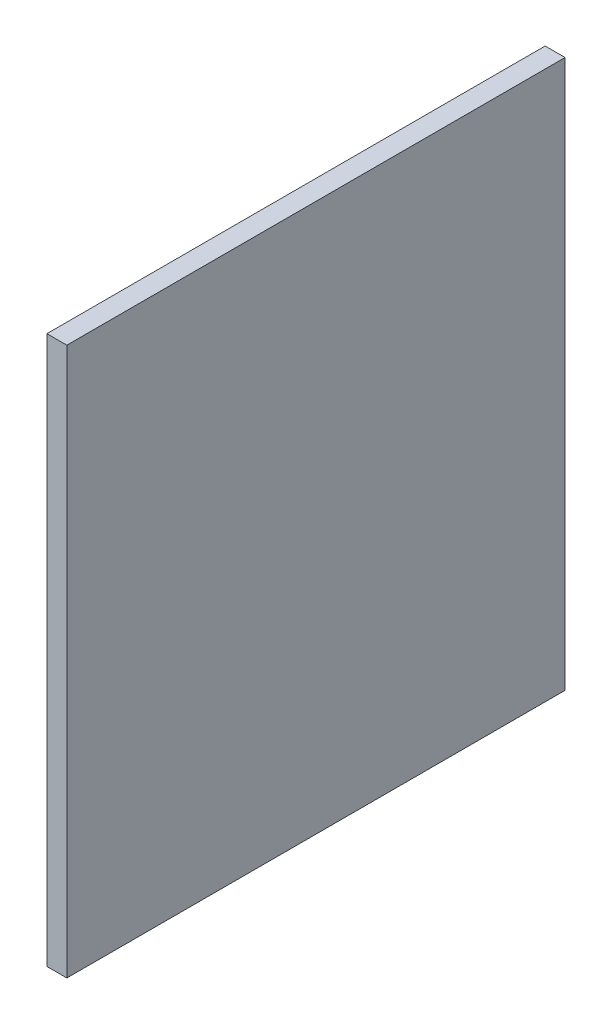
ISO-10303-21;
HEADER;
FILE_DESCRIPTION(('STEP AP214'),'2;1');
FILE_NAME('part.step','',(''),(''),'','','');
FILE_SCHEMA(('AUTOMOTIVE_DESIGN { 1 0 10303 214 1 1 1 1 }'));
ENDSEC;
DATA;
#1=APPLICATION_CONTEXT('core data for automotive mechanical design processes');
#2=APPLICATION_PROTOCOL_DEFINITION('international standard','automotive_design',2000,#1);
#3=PRODUCT_CONTEXT('',#1,'mechanical');
#4=PRODUCT('Part','Part','',(#3));
#5=PRODUCT_RELATED_PRODUCT_CATEGORY('part','',(#4));
#6=PRODUCT_DEFINITION_FORMATION('','',#4);
#7=PRODUCT_DEFINITION_CONTEXT('part definition',#1,'design');
#8=PRODUCT_DEFINITION('design','',#6,#7);
#9=PRODUCT_DEFINITION_SHAPE('','',#8);
#10=(LENGTH_UNIT() NAMED_UNIT(*) SI_UNIT(.MILLI.,.METRE.));
#11=(NAMED_UNIT(*) PLANE_ANGLE_UNIT() SI_UNIT($,.RADIAN.));
#12=(NAMED_UNIT(*) SI_UNIT($,.STERADIAN.) SOLID_ANGLE_UNIT());
#13=UNCERTAINTY_MEASURE_WITH_UNIT(LENGTH_MEASURE(1.E-05),#10,'distance_accuracy_value','');
#14=(GEOMETRIC_REPRESENTATION_CONTEXT(3) GLOBAL_UNCERTAINTY_ASSIGNED_CONTEXT((#13)) GLOBAL_UNIT_ASSIGNED_CONTEXT((#10,
#11,#12)) REPRESENTATION_CONTEXT('',''));
#15=CARTESIAN_POINT('',(0.,0.,0.));
#16=DIRECTION('',(0.,0.,1.));
#17=DIRECTION('',(1.,0.,0.));
#18=AXIS2_PLACEMENT_3D('',#15,#16,#17);
#19=CARTESIAN_POINT('',(2.,-27.5,25.));
#20=DIRECTION('',(0.,0.,-1.));
#21=DIRECTION('',(0.,1.,0.));
#22=AXIS2_PLACEMENT_3D('',#19,#20,#21);
#23=PLANE('',#22);
#24=DIRECTION('',(0.,-1.,0.));
#25=VECTOR('',#24,1.);
#26=CARTESIAN_POINT('',(0.,-27.5,25.));
#27=LINE('',#26,#25);
#28=CARTESIAN_POINT('',(0.,27.5,25.));
#29=VERTEX_POINT('',#28);
#30=CARTESIAN_POINT('',(0.,-27.5,25.));
#31=VERTEX_POINT('',#30);
#32=EDGE_CURVE('E96',#29,#31,#27,.T.);
#33=ORIENTED_EDGE('',*,*,#32,.T.);
#34=DIRECTION('',(-1.,0.,0.));
#35=VECTOR('',#34,1.);
#36=CARTESIAN_POINT('',(2.,-27.5,25.));
#37=LINE('',#36,#35);
#38=CARTESIAN_POINT('',(2.,-27.5,25.));
#39=VERTEX_POINT('',#38);
#40=EDGE_CURVE('E11',#39,#31,#37,.T.);
#41=ORIENTED_EDGE('',*,*,#40,.F.);
#42=DIRECTION('',(0.,-1.,0.));
#43=VECTOR('',#42,1.);
#44=CARTESIAN_POINT('',(2.,-27.5,25.));
#45=LINE('',#44,#43);
#46=CARTESIAN_POINT('',(2.,27.5,25.));
#47=VERTEX_POINT('',#46);
#48=EDGE_CURVE('E84',#47,#39,#45,.T.);
#49=ORIENTED_EDGE('',*,*,#48,.F.);
#50=DIRECTION('',(-1.,0.,0.));
#51=VECTOR('',#50,1.);
#52=CARTESIAN_POINT('',(2.,27.5,25.));
#53=LINE('',#52,#51);
#54=EDGE_CURVE('E92',#47,#29,#53,.T.);
#55=ORIENTED_EDGE('',*,*,#54,.T.);
#56=EDGE_LOOP('',(#33,#41,#49,#55));
#57=FACE_BOUND('',#56,.T.);
#58=ADVANCED_FACE('F33',(#57),#23,.F.);
#59=CARTESIAN_POINT('',(2.,-27.5,-25.));
#60=DIRECTION('',(0.,1.,0.));
#61=DIRECTION('',(0.,0.,1.));
#62=AXIS2_PLACEMENT_3D('',#59,#60,#61);
#63=PLANE('',#62);
#64=DIRECTION('',(0.,0.,-1.));
#65=VECTOR('',#64,1.);
#66=CARTESIAN_POINT('',(0.,-27.5,-25.));
#67=LINE('',#66,#65);
#68=CARTESIAN_POINT('',(0.,-27.5,-25.));
#69=VERTEX_POINT('',#68);
#70=EDGE_CURVE('E88',#31,#69,#67,.T.);
#71=ORIENTED_EDGE('',*,*,#70,.T.);
#72=DIRECTION('',(-1.,0.,0.));
#73=VECTOR('',#72,1.);
#74=CARTESIAN_POINT('',(2.,-27.5,-25.));
#75=LINE('',#74,#73);
#76=CARTESIAN_POINT('',(2.,-27.5,-25.));
#77=VERTEX_POINT('',#76);
#78=EDGE_CURVE('E41',#77,#69,#75,.T.);
#79=ORIENTED_EDGE('',*,*,#78,.F.);
#80=DIRECTION('',(0.,0.,-1.));
#81=VECTOR('',#80,1.);
#82=CARTESIAN_POINT('',(2.,-27.5,-25.));
#83=LINE('',#82,#81);
#84=EDGE_CURVE('E79',#39,#77,#83,.T.);
#85=ORIENTED_EDGE('',*,*,#84,.F.);
#86=ORIENTED_EDGE('',*,*,#40,.T.);
#87=EDGE_LOOP('',(#71,#79,#85,#86));
#88=FACE_BOUND('',#87,.T.);
#89=ADVANCED_FACE('F87',(#88),#63,.F.);
#90=CARTESIAN_POINT('',(2.,-27.5,-25.));
#91=DIRECTION('',(0.,0.,1.));
#92=DIRECTION('',(1.,0.,0.));
#93=AXIS2_PLACEMENT_3D('',#90,#91,#92);
#94=PLANE('',#93);
#95=DIRECTION('',(0.,1.,0.));
#96=VECTOR('',#95,1.);
#97=CARTESIAN_POINT('',(0.,-27.5,-25.));
#98=LINE('',#97,#96);
#99=CARTESIAN_POINT('',(0.,27.5,-25.));
#100=VERTEX_POINT('',#99);
#101=EDGE_CURVE('E66',#69,#100,#98,.T.);
#102=ORIENTED_EDGE('',*,*,#101,.T.);
#103=DIRECTION('',(-1.,0.,0.));
#104=VECTOR('',#103,1.);
#105=CARTESIAN_POINT('',(2.,27.5,-25.));
#106=LINE('',#105,#104);
#107=CARTESIAN_POINT('',(2.,27.5,-25.));
#108=VERTEX_POINT('',#107);
#109=EDGE_CURVE('E89',#108,#100,#106,.T.);
#110=ORIENTED_EDGE('',*,*,#109,.F.);
#111=DIRECTION('',(0.,1.,0.));
#112=VECTOR('',#111,1.);
#113=CARTESIAN_POINT('',(2.,-27.5,-25.));
#114=LINE('',#113,#112);
#115=EDGE_CURVE('E82',#77,#108,#114,.T.);
#116=ORIENTED_EDGE('',*,*,#115,.F.);
#117=ORIENTED_EDGE('',*,*,#78,.T.);
#118=EDGE_LOOP('',(#102,#110,#116,#117));
#119=FACE_BOUND('',#118,.T.);
#120=ADVANCED_FACE('F90',(#119),#94,.F.);
#121=CARTESIAN_POINT('',(2.,27.5,-25.));
#122=DIRECTION('',(0.,-1.,0.));
#123=DIRECTION('',(0.,0.,-1.));
#124=AXIS2_PLACEMENT_3D('',#121,#122,#123);
#125=PLANE('',#124);
#126=DIRECTION('',(0.,0.,1.));
#127=VECTOR('',#126,1.);
#128=CARTESIAN_POINT('',(0.,27.5,-25.));
#129=LINE('',#128,#127);
#130=EDGE_CURVE('E72',#100,#29,#129,.T.);
#131=ORIENTED_EDGE('',*,*,#130,.T.);
#132=ORIENTED_EDGE('',*,*,#54,.F.);
#133=DIRECTION('',(0.,0.,1.));
#134=VECTOR('',#133,1.);
#135=CARTESIAN_POINT('',(2.,27.5,-25.));
#136=LINE('',#135,#134);
#137=EDGE_CURVE('E49',#108,#47,#136,.T.);
#138=ORIENTED_EDGE('',*,*,#137,.F.);
#139=ORIENTED_EDGE('',*,*,#109,.T.);
#140=EDGE_LOOP('',(#131,#132,#138,#139));
#141=FACE_BOUND('',#140,.T.);
#142=ADVANCED_FACE('F103',(#141),#125,.F.);
#143=CARTESIAN_POINT('',(2.,0.,0.));
#144=DIRECTION('',(1.,0.,0.));
#145=DIRECTION('',(0.,0.,-1.));
#146=AXIS2_PLACEMENT_3D('',#143,#144,#145);
#147=PLANE('',#146);
#148=ORIENTED_EDGE('',*,*,#48,.T.);
#149=ORIENTED_EDGE('',*,*,#84,.T.);
#150=ORIENTED_EDGE('',*,*,#115,.T.);
#151=ORIENTED_EDGE('',*,*,#137,.T.);
#152=EDGE_LOOP('',(#148,#149,#150,#151));
#153=FACE_BOUND('',#152,.T.);
#154=ADVANCED_FACE('F80',(#153),#147,.T.);
#155=CARTESIAN_POINT('',(0.,0.,0.));
#156=DIRECTION('',(1.,0.,0.));
#157=DIRECTION('',(0.,0.,-1.));
#158=AXIS2_PLACEMENT_3D('',#155,#156,#157);
#159=PLANE('',#158);
#160=ORIENTED_EDGE('',*,*,#32,.F.);
#161=ORIENTED_EDGE('',*,*,#130,.F.);
#162=ORIENTED_EDGE('',*,*,#101,.F.);
#163=ORIENTED_EDGE('',*,*,#70,.F.);
#164=EDGE_LOOP('',(#160,#161,#162,#163));
#165=FACE_BOUND('',#164,.T.);
#166=ADVANCED_FACE('F106',(#165),#159,.F.);
#167=CLOSED_SHELL('',(#58,#89,#120,#142,#154,#166));
#168=MANIFOLD_SOLID_BREP('B2',#167);
#169=ADVANCED_BREP_SHAPE_REPRESENTATION('',(#18,#168),#14);
#170=SHAPE_DEFINITION_REPRESENTATION(#9,#169);
ENDSEC;
END-ISO-10303-21;
